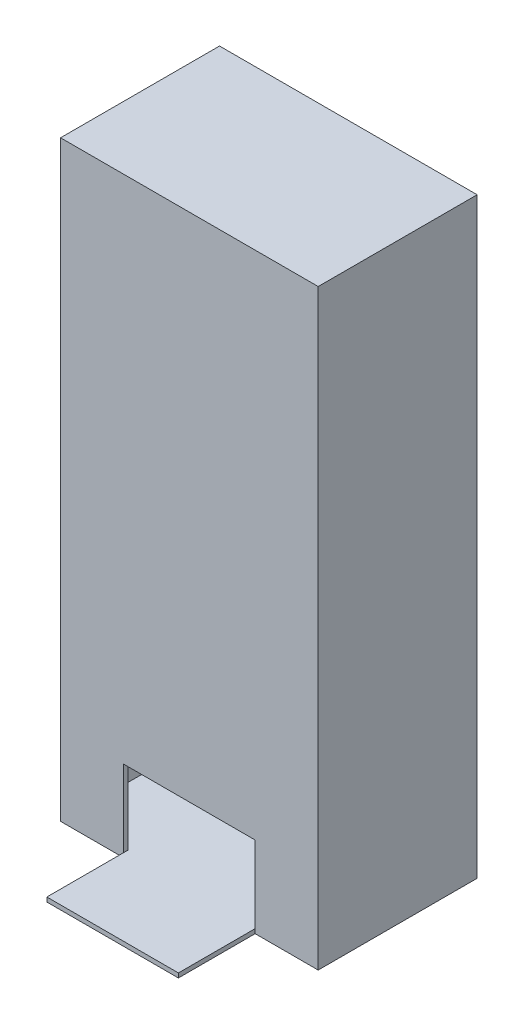
ISO-10303-21;
HEADER;
FILE_DESCRIPTION(('STEP AP214'),'2;1');
FILE_NAME('part.step','',(''),(''),'','','');
FILE_SCHEMA(('AUTOMOTIVE_DESIGN { 1 0 10303 214 1 1 1 1 }'));
ENDSEC;
DATA;
#1=APPLICATION_CONTEXT('core data for automotive mechanical design processes');
#2=APPLICATION_PROTOCOL_DEFINITION('international standard','automotive_design',2000,#1);
#3=PRODUCT_CONTEXT('',#1,'mechanical');
#4=PRODUCT('Part','Part','',(#3));
#5=PRODUCT_RELATED_PRODUCT_CATEGORY('part','',(#4));
#6=PRODUCT_DEFINITION_FORMATION('','',#4);
#7=PRODUCT_DEFINITION_CONTEXT('part definition',#1,'design');
#8=PRODUCT_DEFINITION('design','',#6,#7);
#9=PRODUCT_DEFINITION_SHAPE('','',#8);
#10=(LENGTH_UNIT() NAMED_UNIT(*) SI_UNIT(.MILLI.,.METRE.));
#11=(NAMED_UNIT(*) PLANE_ANGLE_UNIT() SI_UNIT($,.RADIAN.));
#12=(NAMED_UNIT(*) SI_UNIT($,.STERADIAN.) SOLID_ANGLE_UNIT());
#13=UNCERTAINTY_MEASURE_WITH_UNIT(LENGTH_MEASURE(1.E-05),#10,'distance_accuracy_value','');
#14=(GEOMETRIC_REPRESENTATION_CONTEXT(3) GLOBAL_UNCERTAINTY_ASSIGNED_CONTEXT((#13)) GLOBAL_UNIT_ASSIGNED_CONTEXT((#10,
#11,#12)) REPRESENTATION_CONTEXT('',''));
#15=CARTESIAN_POINT('',(0.,0.,0.));
#16=DIRECTION('',(0.,0.,1.));
#17=DIRECTION('',(1.,0.,0.));
#18=AXIS2_PLACEMENT_3D('',#15,#16,#17);
#19=CARTESIAN_POINT('',(0.,0.,141.));
#20=DIRECTION('',(0.,0.,1.));
#21=DIRECTION('',(1.,0.,0.));
#22=AXIS2_PLACEMENT_3D('',#19,#20,#21);
#23=PLANE('',#22);
#24=DIRECTION('',(0.,-1.,0.));
#25=VECTOR('',#24,1.);
#26=CARTESIAN_POINT('',(177.5,0.,141.));
#27=LINE('',#26,#25);
#28=CARTESIAN_POINT('',(177.5,-466.,141.));
#29=VERTEX_POINT('',#28);
#30=CARTESIAN_POINT('',(177.5,-536.,141.));
#31=VERTEX_POINT('',#30);
#32=EDGE_CURVE('E181',#29,#31,#27,.T.);
#33=ORIENTED_EDGE('',*,*,#32,.F.);
#34=DIRECTION('',(1.,0.,0.));
#35=VECTOR('',#34,1.);
#36=CARTESIAN_POINT('',(0.,-466.,141.));
#37=LINE('',#36,#35);
#38=CARTESIAN_POINT('',(57.5,-466.,141.));
#39=VERTEX_POINT('',#38);
#40=EDGE_CURVE('E184',#39,#29,#37,.T.);
#41=ORIENTED_EDGE('',*,*,#40,.F.);
#42=DIRECTION('',(0.,-1.,0.));
#43=VECTOR('',#42,1.);
#44=CARTESIAN_POINT('',(57.5,0.,141.));
#45=LINE('',#44,#43);
#46=CARTESIAN_POINT('',(57.5,-536.,141.));
#47=VERTEX_POINT('',#46);
#48=EDGE_CURVE('E188',#39,#47,#45,.T.);
#49=ORIENTED_EDGE('',*,*,#48,.T.);
#50=DIRECTION('',(-1.,0.,0.));
#51=VECTOR('',#50,1.);
#52=CARTESIAN_POINT('',(4.00000000000006,-536.,141.));
#53=LINE('',#52,#51);
#54=CARTESIAN_POINT('',(4.00000000000006,-536.,141.));
#55=VERTEX_POINT('',#54);
#56=EDGE_CURVE('E47',#47,#55,#53,.T.);
#57=ORIENTED_EDGE('',*,*,#56,.T.);
#58=DIRECTION('',(0.,1.,0.));
#59=VECTOR('',#58,1.);
#60=CARTESIAN_POINT('',(4.,-4.,141.));
#61=LINE('',#60,#59);
#62=CARTESIAN_POINT('',(4.,-4.,141.));
#63=VERTEX_POINT('',#62);
#64=EDGE_CURVE('E221',#55,#63,#61,.T.);
#65=ORIENTED_EDGE('',*,*,#64,.T.);
#66=DIRECTION('',(1.,0.,0.));
#67=VECTOR('',#66,1.);
#68=CARTESIAN_POINT('',(4.,-4.,141.));
#69=LINE('',#68,#67);
#70=CARTESIAN_POINT('',(231.,-4.,141.));
#71=VERTEX_POINT('',#70);
#72=EDGE_CURVE('E217',#63,#71,#69,.T.);
#73=ORIENTED_EDGE('',*,*,#72,.T.);
#74=DIRECTION('',(0.,-1.,0.));
#75=VECTOR('',#74,1.);
#76=CARTESIAN_POINT('',(231.,-4.,141.));
#77=LINE('',#76,#75);
#78=CARTESIAN_POINT('',(231.,-536.,141.));
#79=VERTEX_POINT('',#78);
#80=EDGE_CURVE('E203',#71,#79,#77,.T.);
#81=ORIENTED_EDGE('',*,*,#80,.T.);
#82=EDGE_CURVE('E11',#79,#31,#53,.T.);
#83=ORIENTED_EDGE('',*,*,#82,.T.);
#84=EDGE_LOOP('',(#33,#41,#49,#57,#65,#73,#81,#83));
#85=FACE_BOUND('',#84,.T.);
#86=ADVANCED_FACE('F38',(#85),#23,.F.);
#87=CARTESIAN_POINT('',(0.,0.,4.));
#88=DIRECTION('',(0.,0.,1.));
#89=DIRECTION('',(1.,0.,0.));
#90=AXIS2_PLACEMENT_3D('',#87,#88,#89);
#91=PLANE('',#90);
#92=DIRECTION('',(0.,-1.,0.));
#93=VECTOR('',#92,1.);
#94=CARTESIAN_POINT('',(4.,-4.,4.));
#95=LINE('',#94,#93);
#96=CARTESIAN_POINT('',(4.,-4.,4.));
#97=VERTEX_POINT('',#96);
#98=CARTESIAN_POINT('',(4.00000000000006,-536.,4.));
#99=VERTEX_POINT('',#98);
#100=EDGE_CURVE('E225',#97,#99,#95,.T.);
#101=ORIENTED_EDGE('',*,*,#100,.T.);
#102=DIRECTION('',(1.,0.,0.));
#103=VECTOR('',#102,1.);
#104=CARTESIAN_POINT('',(4.00000000000006,-536.,4.));
#105=LINE('',#104,#103);
#106=CARTESIAN_POINT('',(231.,-536.,4.));
#107=VERTEX_POINT('',#106);
#108=EDGE_CURVE('E229',#99,#107,#105,.T.);
#109=ORIENTED_EDGE('',*,*,#108,.T.);
#110=DIRECTION('',(0.,1.,0.));
#111=VECTOR('',#110,1.);
#112=CARTESIAN_POINT('',(231.,-4.,4.));
#113=LINE('',#112,#111);
#114=CARTESIAN_POINT('',(231.,-4.,4.));
#115=VERTEX_POINT('',#114);
#116=EDGE_CURVE('E233',#107,#115,#113,.T.);
#117=ORIENTED_EDGE('',*,*,#116,.T.);
#118=DIRECTION('',(-1.,0.,0.));
#119=VECTOR('',#118,1.);
#120=CARTESIAN_POINT('',(4.,-4.,4.));
#121=LINE('',#120,#119);
#122=EDGE_CURVE('E237',#115,#97,#121,.T.);
#123=ORIENTED_EDGE('',*,*,#122,.T.);
#124=EDGE_LOOP('',(#101,#109,#117,#123));
#125=FACE_BOUND('',#124,.T.);
#126=ADVANCED_FACE('F363',(#125),#91,.T.);
#127=CARTESIAN_POINT('',(4.00000000000006,-536.,4.));
#128=DIRECTION('',(0.,-1.,0.));
#129=DIRECTION('',(0.,0.,-1.));
#130=AXIS2_PLACEMENT_3D('',#127,#128,#129);
#131=PLANE('',#130);
#132=ORIENTED_EDGE('',*,*,#82,.F.);
#133=DIRECTION('',(0.,0.,1.));
#134=VECTOR('',#133,1.);
#135=CARTESIAN_POINT('',(231.,-536.,4.));
#136=LINE('',#135,#134);
#137=EDGE_CURVE('E251',#107,#79,#136,.T.);
#138=ORIENTED_EDGE('',*,*,#137,.F.);
#139=ORIENTED_EDGE('',*,*,#108,.F.);
#140=DIRECTION('',(0.,0.,1.));
#141=VECTOR('',#140,1.);
#142=CARTESIAN_POINT('',(4.00000000000006,-536.,4.));
#143=LINE('',#142,#141);
#144=EDGE_CURVE('E241',#99,#55,#143,.T.);
#145=ORIENTED_EDGE('',*,*,#144,.T.);
#146=ORIENTED_EDGE('',*,*,#56,.F.);
#147=DIRECTION('',(0.,0.,1.));
#148=VECTOR('',#147,1.);
#149=CARTESIAN_POINT('',(57.5,-536.,141.));
#150=LINE('',#149,#148);
#151=CARTESIAN_POINT('',(57.5,-536.,145.));
#152=VERTEX_POINT('',#151);
#153=EDGE_CURVE('E204',#47,#152,#150,.T.);
#154=ORIENTED_EDGE('',*,*,#153,.T.);
#155=DIRECTION('',(0.,0.,-1.));
#156=VECTOR('',#155,1.);
#157=CARTESIAN_POINT('',(57.5,-536.,215.));
#158=LINE('',#157,#156);
#159=CARTESIAN_POINT('',(57.5,-536.,215.));
#160=VERTEX_POINT('',#159);
#161=EDGE_CURVE('E332',#160,#152,#158,.T.);
#162=ORIENTED_EDGE('',*,*,#161,.F.);
#163=DIRECTION('',(-1.,0.,0.));
#164=VECTOR('',#163,1.);
#165=CARTESIAN_POINT('',(57.5,-536.,215.));
#166=LINE('',#165,#164);
#167=CARTESIAN_POINT('',(177.5,-536.,215.));
#168=VERTEX_POINT('',#167);
#169=EDGE_CURVE('E161',#168,#160,#166,.T.);
#170=ORIENTED_EDGE('',*,*,#169,.F.);
#171=DIRECTION('',(0.,0.,-1.));
#172=VECTOR('',#171,1.);
#173=CARTESIAN_POINT('',(177.5,-536.,215.));
#174=LINE('',#173,#172);
#175=CARTESIAN_POINT('',(177.5,-536.,145.));
#176=VERTEX_POINT('',#175);
#177=EDGE_CURVE('E177',#168,#176,#174,.T.);
#178=ORIENTED_EDGE('',*,*,#177,.T.);
#179=DIRECTION('',(0.,0.,1.));
#180=VECTOR('',#179,1.);
#181=CARTESIAN_POINT('',(177.5,-536.,141.));
#182=LINE('',#181,#180);
#183=EDGE_CURVE('E199',#31,#176,#182,.T.);
#184=ORIENTED_EDGE('',*,*,#183,.F.);
#185=EDGE_LOOP('',(#132,#138,#139,#145,#146,#154,#162,#170,#178,#184));
#186=FACE_BOUND('',#185,.T.);
#187=ADVANCED_FACE('F307',(#186),#131,.F.);
#188=CARTESIAN_POINT('',(231.,-4.,4.));
#189=DIRECTION('',(1.,0.,0.));
#190=DIRECTION('',(0.,1.,0.));
#191=AXIS2_PLACEMENT_3D('',#188,#189,#190);
#192=PLANE('',#191);
#193=ORIENTED_EDGE('',*,*,#80,.F.);
#194=DIRECTION('',(0.,0.,1.));
#195=VECTOR('',#194,1.);
#196=CARTESIAN_POINT('',(231.,-4.,4.));
#197=LINE('',#196,#195);
#198=EDGE_CURVE('E247',#115,#71,#197,.T.);
#199=ORIENTED_EDGE('',*,*,#198,.F.);
#200=ORIENTED_EDGE('',*,*,#116,.F.);
#201=ORIENTED_EDGE('',*,*,#137,.T.);
#202=EDGE_LOOP('',(#193,#199,#200,#201));
#203=FACE_BOUND('',#202,.T.);
#204=ADVANCED_FACE('F315',(#203),#192,.F.);
#205=CARTESIAN_POINT('',(4.,-4.,4.));
#206=DIRECTION('',(0.,1.,0.));
#207=DIRECTION('',(0.,0.,1.));
#208=AXIS2_PLACEMENT_3D('',#205,#206,#207);
#209=PLANE('',#208);
#210=ORIENTED_EDGE('',*,*,#72,.F.);
#211=DIRECTION('',(0.,0.,1.));
#212=VECTOR('',#211,1.);
#213=CARTESIAN_POINT('',(4.,-4.,4.));
#214=LINE('',#213,#212);
#215=EDGE_CURVE('E242',#97,#63,#214,.T.);
#216=ORIENTED_EDGE('',*,*,#215,.F.);
#217=ORIENTED_EDGE('',*,*,#122,.F.);
#218=ORIENTED_EDGE('',*,*,#198,.T.);
#219=EDGE_LOOP('',(#210,#216,#217,#218));
#220=FACE_BOUND('',#219,.T.);
#221=ADVANCED_FACE('F313',(#220),#209,.F.);
#222=CARTESIAN_POINT('',(4.,-4.,4.));
#223=DIRECTION('',(-1.,0.,0.));
#224=DIRECTION('',(0.,-1.,0.));
#225=AXIS2_PLACEMENT_3D('',#222,#223,#224);
#226=PLANE('',#225);
#227=ORIENTED_EDGE('',*,*,#64,.F.);
#228=ORIENTED_EDGE('',*,*,#144,.F.);
#229=ORIENTED_EDGE('',*,*,#100,.F.);
#230=ORIENTED_EDGE('',*,*,#215,.T.);
#231=EDGE_LOOP('',(#227,#228,#229,#230));
#232=FACE_BOUND('',#231,.T.);
#233=ADVANCED_FACE('F310',(#232),#226,.F.);
#234=CARTESIAN_POINT('',(177.5,0.,141.));
#235=DIRECTION('',(-1.,0.,0.));
#236=DIRECTION('',(0.,0.,1.));
#237=AXIS2_PLACEMENT_3D('',#234,#235,#236);
#238=PLANE('',#237);
#239=DIRECTION('',(0.,-1.,0.));
#240=VECTOR('',#239,1.);
#241=CARTESIAN_POINT('',(177.5,0.,145.));
#242=LINE('',#241,#240);
#243=CARTESIAN_POINT('',(177.5,-466.,145.));
#244=VERTEX_POINT('',#243);
#245=EDGE_CURVE('E170',#244,#176,#242,.T.);
#246=ORIENTED_EDGE('',*,*,#245,.F.);
#247=DIRECTION('',(0.,0.,1.));
#248=VECTOR('',#247,1.);
#249=CARTESIAN_POINT('',(177.5,-466.,141.));
#250=LINE('',#249,#248);
#251=EDGE_CURVE('E191',#29,#244,#250,.T.);
#252=ORIENTED_EDGE('',*,*,#251,.F.);
#253=ORIENTED_EDGE('',*,*,#32,.T.);
#254=ORIENTED_EDGE('',*,*,#183,.T.);
#255=EDGE_LOOP('',(#246,#252,#253,#254));
#256=FACE_BOUND('',#255,.T.);
#257=ADVANCED_FACE('F321',(#256),#238,.T.);
#258=CARTESIAN_POINT('',(57.5,0.,141.));
#259=DIRECTION('',(-1.,0.,0.));
#260=DIRECTION('',(0.,-1.,0.));
#261=AXIS2_PLACEMENT_3D('',#258,#259,#260);
#262=PLANE('',#261);
#263=DIRECTION('',(0.,-1.,0.));
#264=VECTOR('',#263,1.);
#265=CARTESIAN_POINT('',(57.5,0.,145.));
#266=LINE('',#265,#264);
#267=CARTESIAN_POINT('',(57.5,-466.,145.));
#268=VERTEX_POINT('',#267);
#269=EDGE_CURVE('E185',#268,#152,#266,.T.);
#270=ORIENTED_EDGE('',*,*,#269,.T.);
#271=ORIENTED_EDGE('',*,*,#153,.F.);
#272=ORIENTED_EDGE('',*,*,#48,.F.);
#273=DIRECTION('',(0.,0.,1.));
#274=VECTOR('',#273,1.);
#275=CARTESIAN_POINT('',(57.5,-466.,141.));
#276=LINE('',#275,#274);
#277=EDGE_CURVE('E208',#39,#268,#276,.T.);
#278=ORIENTED_EDGE('',*,*,#277,.T.);
#279=EDGE_LOOP('',(#270,#271,#272,#278));
#280=FACE_BOUND('',#279,.T.);
#281=ADVANCED_FACE('F347',(#280),#262,.F.);
#282=CARTESIAN_POINT('',(0.,-466.,141.));
#283=DIRECTION('',(0.,-1.,0.));
#284=DIRECTION('',(0.,0.,-1.));
#285=AXIS2_PLACEMENT_3D('',#282,#283,#284);
#286=PLANE('',#285);
#287=DIRECTION('',(1.,0.,0.));
#288=VECTOR('',#287,1.);
#289=CARTESIAN_POINT('',(0.,-466.,145.));
#290=LINE('',#289,#288);
#291=EDGE_CURVE('E175',#268,#244,#290,.T.);
#292=ORIENTED_EDGE('',*,*,#291,.F.);
#293=ORIENTED_EDGE('',*,*,#277,.F.);
#294=ORIENTED_EDGE('',*,*,#40,.T.);
#295=ORIENTED_EDGE('',*,*,#251,.T.);
#296=EDGE_LOOP('',(#292,#293,#294,#295));
#297=FACE_BOUND('',#296,.T.);
#298=ADVANCED_FACE('F352',(#297),#286,.T.);
#299=CARTESIAN_POINT('',(0.,0.,145.));
#300=DIRECTION('',(0.,0.,1.));
#301=DIRECTION('',(1.,0.,0.));
#302=AXIS2_PLACEMENT_3D('',#299,#300,#301);
#303=PLANE('',#302);
#304=DIRECTION('',(0.,-1.,0.));
#305=VECTOR('',#304,1.);
#306=CARTESIAN_POINT('',(57.5,-536.,145.));
#307=LINE('',#306,#305);
#308=CARTESIAN_POINT('',(57.5,-540.,145.));
#309=VERTEX_POINT('',#308);
#310=EDGE_CURVE('E168',#152,#309,#307,.T.);
#311=ORIENTED_EDGE('',*,*,#310,.F.);
#312=ORIENTED_EDGE('',*,*,#269,.F.);
#313=ORIENTED_EDGE('',*,*,#291,.T.);
#314=ORIENTED_EDGE('',*,*,#245,.T.);
#315=DIRECTION('',(0.,1.,0.));
#316=VECTOR('',#315,1.);
#317=CARTESIAN_POINT('',(177.5,-536.,145.));
#318=LINE('',#317,#316);
#319=CARTESIAN_POINT('',(177.5,-540.,145.));
#320=VERTEX_POINT('',#319);
#321=EDGE_CURVE('E54',#320,#176,#318,.T.);
#322=ORIENTED_EDGE('',*,*,#321,.F.);
#323=DIRECTION('',(1.,0.,0.));
#324=VECTOR('',#323,1.);
#325=CARTESIAN_POINT('',(0.,-540.,145.));
#326=LINE('',#325,#324);
#327=CARTESIAN_POINT('',(235.,-540.,145.));
#328=VERTEX_POINT('',#327);
#329=EDGE_CURVE('E261',#320,#328,#326,.T.);
#330=ORIENTED_EDGE('',*,*,#329,.T.);
#331=DIRECTION('',(0.,1.,0.));
#332=VECTOR('',#331,1.);
#333=CARTESIAN_POINT('',(235.,0.,145.));
#334=LINE('',#333,#332);
#335=CARTESIAN_POINT('',(235.,0.,145.));
#336=VERTEX_POINT('',#335);
#337=EDGE_CURVE('E265',#328,#336,#334,.T.);
#338=ORIENTED_EDGE('',*,*,#337,.T.);
#339=DIRECTION('',(-1.,0.,0.));
#340=VECTOR('',#339,1.);
#341=CARTESIAN_POINT('',(0.,0.,145.));
#342=LINE('',#341,#340);
#343=CARTESIAN_POINT('',(0.,0.,145.));
#344=VERTEX_POINT('',#343);
#345=EDGE_CURVE('E268',#336,#344,#342,.T.);
#346=ORIENTED_EDGE('',*,*,#345,.T.);
#347=DIRECTION('',(0.,-1.,0.));
#348=VECTOR('',#347,1.);
#349=CARTESIAN_POINT('',(0.,0.,145.));
#350=LINE('',#349,#348);
#351=CARTESIAN_POINT('',(0.,-540.,145.));
#352=VERTEX_POINT('',#351);
#353=EDGE_CURVE('E258',#344,#352,#350,.T.);
#354=ORIENTED_EDGE('',*,*,#353,.T.);
#355=EDGE_CURVE('E61',#352,#309,#326,.T.);
#356=ORIENTED_EDGE('',*,*,#355,.T.);
#357=EDGE_LOOP('',(#311,#312,#313,#314,#322,#330,#338,#346,#354,#356));
#358=FACE_BOUND('',#357,.T.);
#359=ADVANCED_FACE('F350',(#358),#303,.T.);
#360=CARTESIAN_POINT('',(0.,0.,145.));
#361=DIRECTION('',(1.,0.,0.));
#362=DIRECTION('',(0.,1.,0.));
#363=AXIS2_PLACEMENT_3D('',#360,#361,#362);
#364=PLANE('',#363);
#365=DIRECTION('',(0.,0.,-1.));
#366=VECTOR('',#365,1.);
#367=CARTESIAN_POINT('',(0.,0.,145.));
#368=LINE('',#367,#366);
#369=CARTESIAN_POINT('',(0.,0.,0.));
#370=VERTEX_POINT('',#369);
#371=EDGE_CURVE('E271',#344,#370,#368,.T.);
#372=ORIENTED_EDGE('',*,*,#371,.T.);
#373=DIRECTION('',(0.,-1.,0.));
#374=VECTOR('',#373,1.);
#375=CARTESIAN_POINT('',(0.,0.,0.));
#376=LINE('',#375,#374);
#377=CARTESIAN_POINT('',(0.,-540.,0.));
#378=VERTEX_POINT('',#377);
#379=EDGE_CURVE('E246',#370,#378,#376,.T.);
#380=ORIENTED_EDGE('',*,*,#379,.T.);
#381=DIRECTION('',(0.,0.,-1.));
#382=VECTOR('',#381,1.);
#383=CARTESIAN_POINT('',(0.,-540.,145.));
#384=LINE('',#383,#382);
#385=EDGE_CURVE('E293',#352,#378,#384,.T.);
#386=ORIENTED_EDGE('',*,*,#385,.F.);
#387=ORIENTED_EDGE('',*,*,#353,.F.);
#388=EDGE_LOOP('',(#372,#380,#386,#387));
#389=FACE_BOUND('',#388,.T.);
#390=ADVANCED_FACE('F40',(#389),#364,.F.);
#391=CARTESIAN_POINT('',(0.,-540.,145.));
#392=DIRECTION('',(0.,1.,0.));
#393=DIRECTION('',(0.,0.,1.));
#394=AXIS2_PLACEMENT_3D('',#391,#392,#393);
#395=PLANE('',#394);
#396=ORIENTED_EDGE('',*,*,#385,.T.);
#397=DIRECTION('',(1.,0.,0.));
#398=VECTOR('',#397,1.);
#399=CARTESIAN_POINT('',(0.,-540.,0.));
#400=LINE('',#399,#398);
#401=CARTESIAN_POINT('',(235.,-540.,0.));
#402=VERTEX_POINT('',#401);
#403=EDGE_CURVE('E275',#378,#402,#400,.T.);
#404=ORIENTED_EDGE('',*,*,#403,.T.);
#405=DIRECTION('',(0.,0.,-1.));
#406=VECTOR('',#405,1.);
#407=CARTESIAN_POINT('',(235.,-540.,145.));
#408=LINE('',#407,#406);
#409=EDGE_CURVE('E291',#328,#402,#408,.T.);
#410=ORIENTED_EDGE('',*,*,#409,.F.);
#411=ORIENTED_EDGE('',*,*,#329,.F.);
#412=DIRECTION('',(0.,0.,-1.));
#413=VECTOR('',#412,1.);
#414=CARTESIAN_POINT('',(177.5,-540.,215.));
#415=LINE('',#414,#413);
#416=CARTESIAN_POINT('',(177.5,-540.,215.));
#417=VERTEX_POINT('',#416);
#418=EDGE_CURVE('E151',#417,#320,#415,.T.);
#419=ORIENTED_EDGE('',*,*,#418,.F.);
#420=DIRECTION('',(1.,0.,0.));
#421=VECTOR('',#420,1.);
#422=CARTESIAN_POINT('',(57.5,-540.,215.));
#423=LINE('',#422,#421);
#424=CARTESIAN_POINT('',(57.5,-540.,215.));
#425=VERTEX_POINT('',#424);
#426=EDGE_CURVE('E144',#425,#417,#423,.T.);
#427=ORIENTED_EDGE('',*,*,#426,.F.);
#428=DIRECTION('',(0.,0.,-1.));
#429=VECTOR('',#428,1.);
#430=CARTESIAN_POINT('',(57.5,-540.,215.));
#431=LINE('',#430,#429);
#432=EDGE_CURVE('E148',#425,#309,#431,.T.);
#433=ORIENTED_EDGE('',*,*,#432,.T.);
#434=ORIENTED_EDGE('',*,*,#355,.F.);
#435=EDGE_LOOP('',(#396,#404,#410,#411,#419,#427,#433,#434));
#436=FACE_BOUND('',#435,.T.);
#437=ADVANCED_FACE('F146',(#436),#395,.F.);
#438=CARTESIAN_POINT('',(235.,0.,145.));
#439=DIRECTION('',(-1.,0.,0.));
#440=DIRECTION('',(0.,-1.,0.));
#441=AXIS2_PLACEMENT_3D('',#438,#439,#440);
#442=PLANE('',#441);
#443=ORIENTED_EDGE('',*,*,#409,.T.);
#444=DIRECTION('',(0.,1.,0.));
#445=VECTOR('',#444,1.);
#446=CARTESIAN_POINT('',(235.,0.,0.));
#447=LINE('',#446,#445);
#448=CARTESIAN_POINT('',(235.,0.,0.));
#449=VERTEX_POINT('',#448);
#450=EDGE_CURVE('E279',#402,#449,#447,.T.);
#451=ORIENTED_EDGE('',*,*,#450,.T.);
#452=DIRECTION('',(0.,0.,-1.));
#453=VECTOR('',#452,1.);
#454=CARTESIAN_POINT('',(235.,0.,145.));
#455=LINE('',#454,#453);
#456=EDGE_CURVE('E288',#336,#449,#455,.T.);
#457=ORIENTED_EDGE('',*,*,#456,.F.);
#458=ORIENTED_EDGE('',*,*,#337,.F.);
#459=EDGE_LOOP('',(#443,#451,#457,#458));
#460=FACE_BOUND('',#459,.T.);
#461=ADVANCED_FACE('F386',(#460),#442,.F.);
#462=CARTESIAN_POINT('',(0.,0.,145.));
#463=DIRECTION('',(0.,-1.,0.));
#464=DIRECTION('',(0.,0.,-1.));
#465=AXIS2_PLACEMENT_3D('',#462,#463,#464);
#466=PLANE('',#465);
#467=ORIENTED_EDGE('',*,*,#456,.T.);
#468=DIRECTION('',(-1.,0.,0.));
#469=VECTOR('',#468,1.);
#470=CARTESIAN_POINT('',(0.,0.,0.));
#471=LINE('',#470,#469);
#472=EDGE_CURVE('E262',#449,#370,#471,.T.);
#473=ORIENTED_EDGE('',*,*,#472,.T.);
#474=ORIENTED_EDGE('',*,*,#371,.F.);
#475=ORIENTED_EDGE('',*,*,#345,.F.);
#476=EDGE_LOOP('',(#467,#473,#474,#475));
#477=FACE_BOUND('',#476,.T.);
#478=ADVANCED_FACE('F382',(#477),#466,.F.);
#479=CARTESIAN_POINT('',(0.,0.,0.));
#480=DIRECTION('',(0.,0.,1.));
#481=DIRECTION('',(1.,0.,0.));
#482=AXIS2_PLACEMENT_3D('',#479,#480,#481);
#483=PLANE('',#482);
#484=ORIENTED_EDGE('',*,*,#379,.F.);
#485=ORIENTED_EDGE('',*,*,#472,.F.);
#486=ORIENTED_EDGE('',*,*,#450,.F.);
#487=ORIENTED_EDGE('',*,*,#403,.F.);
#488=EDGE_LOOP('',(#484,#485,#486,#487));
#489=FACE_BOUND('',#488,.T.);
#490=ADVANCED_FACE('F379',(#489),#483,.F.);
#491=CARTESIAN_POINT('',(57.5,-536.,215.));
#492=DIRECTION('',(1.,0.,0.));
#493=DIRECTION('',(0.,0.,-1.));
#494=AXIS2_PLACEMENT_3D('',#491,#492,#493);
#495=PLANE('',#494);
#496=ORIENTED_EDGE('',*,*,#310,.T.);
#497=ORIENTED_EDGE('',*,*,#432,.F.);
#498=DIRECTION('',(0.,-1.,0.));
#499=VECTOR('',#498,1.);
#500=CARTESIAN_POINT('',(57.5,-536.,215.));
#501=LINE('',#500,#499);
#502=EDGE_CURVE('E156',#160,#425,#501,.T.);
#503=ORIENTED_EDGE('',*,*,#502,.F.);
#504=ORIENTED_EDGE('',*,*,#161,.T.);
#505=EDGE_LOOP('',(#496,#497,#503,#504));
#506=FACE_BOUND('',#505,.T.);
#507=ADVANCED_FACE('F167',(#506),#495,.F.);
#508=CARTESIAN_POINT('',(177.5,-536.,215.));
#509=DIRECTION('',(-1.,0.,0.));
#510=DIRECTION('',(0.,0.,1.));
#511=AXIS2_PLACEMENT_3D('',#508,#509,#510);
#512=PLANE('',#511);
#513=ORIENTED_EDGE('',*,*,#321,.T.);
#514=ORIENTED_EDGE('',*,*,#177,.F.);
#515=DIRECTION('',(0.,1.,0.));
#516=VECTOR('',#515,1.);
#517=CARTESIAN_POINT('',(177.5,-536.,215.));
#518=LINE('',#517,#516);
#519=EDGE_CURVE('E155',#417,#168,#518,.T.);
#520=ORIENTED_EDGE('',*,*,#519,.F.);
#521=ORIENTED_EDGE('',*,*,#418,.T.);
#522=EDGE_LOOP('',(#513,#514,#520,#521));
#523=FACE_BOUND('',#522,.T.);
#524=ADVANCED_FACE('F324',(#523),#512,.F.);
#525=CARTESIAN_POINT('',(0.,0.,215.));
#526=DIRECTION('',(0.,0.,1.));
#527=DIRECTION('',(1.,0.,0.));
#528=AXIS2_PLACEMENT_3D('',#525,#526,#527);
#529=PLANE('',#528);
#530=ORIENTED_EDGE('',*,*,#502,.T.);
#531=ORIENTED_EDGE('',*,*,#426,.T.);
#532=ORIENTED_EDGE('',*,*,#519,.T.);
#533=ORIENTED_EDGE('',*,*,#169,.T.);
#534=EDGE_LOOP('',(#530,#531,#532,#533));
#535=FACE_BOUND('',#534,.T.);
#536=ADVANCED_FACE('F159',(#535),#529,.T.);
#537=CLOSED_SHELL('',(#86,#126,#187,#204,#221,#233,#257,#281,#298,#359,#390,#437,#461,#478,#490,
#507,#524,#536));
#538=MANIFOLD_SOLID_BREP('B2',#537);
#539=ADVANCED_BREP_SHAPE_REPRESENTATION('',(#18,#538),#14);
#540=SHAPE_DEFINITION_REPRESENTATION(#9,#539);
ENDSEC;
END-ISO-10303-21;
